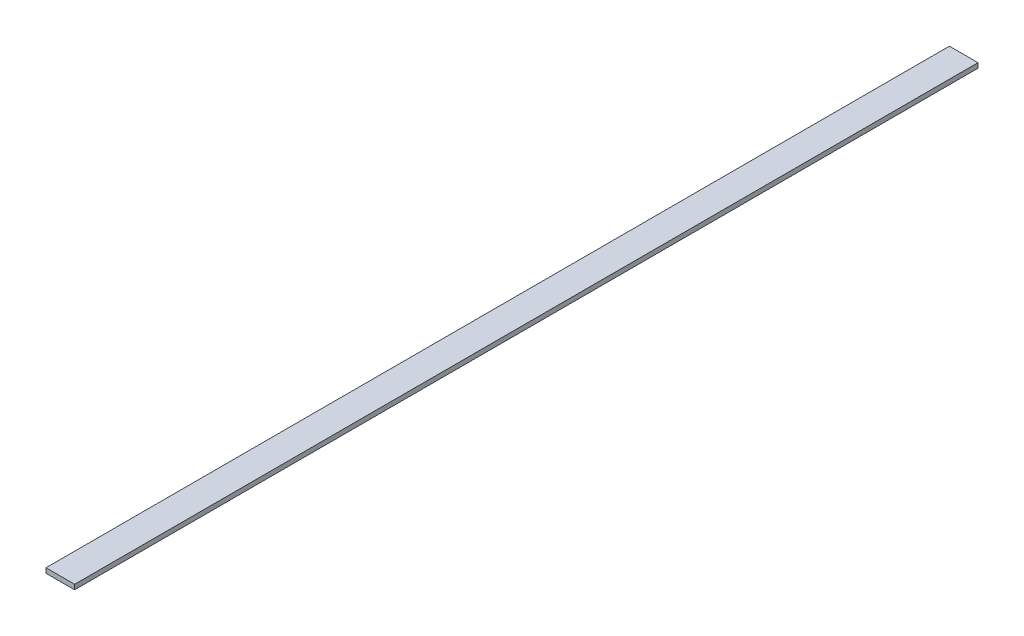
ISO-10303-21;
HEADER;
FILE_DESCRIPTION(('STEP AP214'),'2;1');
FILE_NAME('part.step','',(''),(''),'','','');
FILE_SCHEMA(('AUTOMOTIVE_DESIGN { 1 0 10303 214 1 1 1 1 }'));
ENDSEC;
DATA;
#1=APPLICATION_CONTEXT('core data for automotive mechanical design processes');
#2=APPLICATION_PROTOCOL_DEFINITION('international standard','automotive_design',2000,#1);
#3=PRODUCT_CONTEXT('',#1,'mechanical');
#4=PRODUCT('Part','Part','',(#3));
#5=PRODUCT_RELATED_PRODUCT_CATEGORY('part','',(#4));
#6=PRODUCT_DEFINITION_FORMATION('','',#4);
#7=PRODUCT_DEFINITION_CONTEXT('part definition',#1,'design');
#8=PRODUCT_DEFINITION('design','',#6,#7);
#9=PRODUCT_DEFINITION_SHAPE('','',#8);
#10=(LENGTH_UNIT() NAMED_UNIT(*) SI_UNIT(.MILLI.,.METRE.));
#11=(NAMED_UNIT(*) PLANE_ANGLE_UNIT() SI_UNIT($,.RADIAN.));
#12=(NAMED_UNIT(*) SI_UNIT($,.STERADIAN.) SOLID_ANGLE_UNIT());
#13=UNCERTAINTY_MEASURE_WITH_UNIT(LENGTH_MEASURE(1.E-05),#10,'distance_accuracy_value','');
#14=(GEOMETRIC_REPRESENTATION_CONTEXT(3) GLOBAL_UNCERTAINTY_ASSIGNED_CONTEXT((#13)) GLOBAL_UNIT_ASSIGNED_CONTEXT((#10,
#11,#12)) REPRESENTATION_CONTEXT('',''));
#15=CARTESIAN_POINT('',(0.,0.,0.));
#16=DIRECTION('',(0.,0.,1.));
#17=DIRECTION('',(1.,0.,0.));
#18=AXIS2_PLACEMENT_3D('',#15,#16,#17);
#19=CARTESIAN_POINT('',(0.,0.,600.));
#20=DIRECTION('',(1.,0.,0.));
#21=DIRECTION('',(0.,0.,-1.));
#22=AXIS2_PLACEMENT_3D('',#19,#20,#21);
#23=PLANE('',#22);
#24=DIRECTION('',(0.,-1.,0.));
#25=VECTOR('',#24,1.);
#26=CARTESIAN_POINT('',(0.,0.,0.));
#27=LINE('',#26,#25);
#28=CARTESIAN_POINT('',(0.,3.2,0.));
#29=VERTEX_POINT('',#28);
#30=CARTESIAN_POINT('',(0.,0.,0.));
#31=VERTEX_POINT('',#30);
#32=EDGE_CURVE('E107',#29,#31,#27,.T.);
#33=ORIENTED_EDGE('',*,*,#32,.T.);
#34=DIRECTION('',(0.,0.,-1.));
#35=VECTOR('',#34,1.);
#36=CARTESIAN_POINT('',(0.,0.,600.));
#37=LINE('',#36,#35);
#38=CARTESIAN_POINT('',(0.,0.,600.));
#39=VERTEX_POINT('',#38);
#40=EDGE_CURVE('E11',#39,#31,#37,.T.);
#41=ORIENTED_EDGE('',*,*,#40,.F.);
#42=DIRECTION('',(0.,-1.,0.));
#43=VECTOR('',#42,1.);
#44=CARTESIAN_POINT('',(0.,0.,600.));
#45=LINE('',#44,#43);
#46=CARTESIAN_POINT('',(0.,3.2,600.));
#47=VERTEX_POINT('',#46);
#48=EDGE_CURVE('E91',#47,#39,#45,.T.);
#49=ORIENTED_EDGE('',*,*,#48,.F.);
#50=DIRECTION('',(0.,0.,-1.));
#51=VECTOR('',#50,1.);
#52=CARTESIAN_POINT('',(0.,3.2,600.));
#53=LINE('',#52,#51);
#54=EDGE_CURVE('E103',#47,#29,#53,.T.);
#55=ORIENTED_EDGE('',*,*,#54,.T.);
#56=EDGE_LOOP('',(#33,#41,#49,#55));
#57=FACE_BOUND('',#56,.T.);
#58=ADVANCED_FACE('F39',(#57),#23,.F.);
#59=CARTESIAN_POINT('',(0.,0.,600.));
#60=DIRECTION('',(0.,1.,0.));
#61=DIRECTION('',(0.,0.,1.));
#62=AXIS2_PLACEMENT_3D('',#59,#60,#61);
#63=PLANE('',#62);
#64=DIRECTION('',(1.,0.,0.));
#65=VECTOR('',#64,1.);
#66=CARTESIAN_POINT('',(0.,0.,0.));
#67=LINE('',#66,#65);
#68=CARTESIAN_POINT('',(19.,0.,0.));
#69=VERTEX_POINT('',#68);
#70=EDGE_CURVE('E96',#31,#69,#67,.T.);
#71=ORIENTED_EDGE('',*,*,#70,.T.);
#72=DIRECTION('',(0.,0.,-1.));
#73=VECTOR('',#72,1.);
#74=CARTESIAN_POINT('',(19.,0.,600.));
#75=LINE('',#74,#73);
#76=CARTESIAN_POINT('',(19.,0.,600.));
#77=VERTEX_POINT('',#76);
#78=EDGE_CURVE('E48',#77,#69,#75,.T.);
#79=ORIENTED_EDGE('',*,*,#78,.F.);
#80=DIRECTION('',(1.,0.,0.));
#81=VECTOR('',#80,1.);
#82=CARTESIAN_POINT('',(0.,0.,600.));
#83=LINE('',#82,#81);
#84=EDGE_CURVE('E86',#39,#77,#83,.T.);
#85=ORIENTED_EDGE('',*,*,#84,.F.);
#86=ORIENTED_EDGE('',*,*,#40,.T.);
#87=EDGE_LOOP('',(#71,#79,#85,#86));
#88=FACE_BOUND('',#87,.T.);
#89=ADVANCED_FACE('F95',(#88),#63,.F.);
#90=CARTESIAN_POINT('',(19.,0.,600.));
#91=DIRECTION('',(-1.,0.,0.));
#92=DIRECTION('',(0.,0.,1.));
#93=AXIS2_PLACEMENT_3D('',#90,#91,#92);
#94=PLANE('',#93);
#95=DIRECTION('',(0.,1.,0.));
#96=VECTOR('',#95,1.);
#97=CARTESIAN_POINT('',(19.,0.,0.));
#98=LINE('',#97,#96);
#99=CARTESIAN_POINT('',(19.,3.2,0.));
#100=VERTEX_POINT('',#99);
#101=EDGE_CURVE('E73',#69,#100,#98,.T.);
#102=ORIENTED_EDGE('',*,*,#101,.T.);
#103=DIRECTION('',(0.,0.,-1.));
#104=VECTOR('',#103,1.);
#105=CARTESIAN_POINT('',(19.,3.2,600.));
#106=LINE('',#105,#104);
#107=CARTESIAN_POINT('',(19.,3.2,600.));
#108=VERTEX_POINT('',#107);
#109=EDGE_CURVE('E98',#108,#100,#106,.T.);
#110=ORIENTED_EDGE('',*,*,#109,.F.);
#111=DIRECTION('',(0.,1.,0.));
#112=VECTOR('',#111,1.);
#113=CARTESIAN_POINT('',(19.,0.,600.));
#114=LINE('',#113,#112);
#115=EDGE_CURVE('E89',#77,#108,#114,.T.);
#116=ORIENTED_EDGE('',*,*,#115,.F.);
#117=ORIENTED_EDGE('',*,*,#78,.T.);
#118=EDGE_LOOP('',(#102,#110,#116,#117));
#119=FACE_BOUND('',#118,.T.);
#120=ADVANCED_FACE('F99',(#119),#94,.F.);
#121=CARTESIAN_POINT('',(0.,3.2,600.));
#122=DIRECTION('',(0.,-1.,0.));
#123=DIRECTION('',(0.,0.,-1.));
#124=AXIS2_PLACEMENT_3D('',#121,#122,#123);
#125=PLANE('',#124);
#126=DIRECTION('',(-1.,0.,0.));
#127=VECTOR('',#126,1.);
#128=CARTESIAN_POINT('',(0.,3.2,0.));
#129=LINE('',#128,#127);
#130=EDGE_CURVE('E79',#100,#29,#129,.T.);
#131=ORIENTED_EDGE('',*,*,#130,.T.);
#132=ORIENTED_EDGE('',*,*,#54,.F.);
#133=DIRECTION('',(-1.,0.,0.));
#134=VECTOR('',#133,1.);
#135=CARTESIAN_POINT('',(0.,3.2,600.));
#136=LINE('',#135,#134);
#137=EDGE_CURVE('E56',#108,#47,#136,.T.);
#138=ORIENTED_EDGE('',*,*,#137,.F.);
#139=ORIENTED_EDGE('',*,*,#109,.T.);
#140=EDGE_LOOP('',(#131,#132,#138,#139));
#141=FACE_BOUND('',#140,.T.);
#142=ADVANCED_FACE('F120',(#141),#125,.F.);
#143=CARTESIAN_POINT('',(0.,0.,600.));
#144=DIRECTION('',(0.,0.,-1.));
#145=DIRECTION('',(-1.,0.,0.));
#146=AXIS2_PLACEMENT_3D('',#143,#144,#145);
#147=PLANE('',#146);
#148=ORIENTED_EDGE('',*,*,#48,.T.);
#149=ORIENTED_EDGE('',*,*,#84,.T.);
#150=ORIENTED_EDGE('',*,*,#115,.T.);
#151=ORIENTED_EDGE('',*,*,#137,.T.);
#152=EDGE_LOOP('',(#148,#149,#150,#151));
#153=FACE_BOUND('',#152,.T.);
#154=ADVANCED_FACE('F87',(#153),#147,.F.);
#155=CARTESIAN_POINT('',(0.,0.,0.));
#156=DIRECTION('',(0.,0.,-1.));
#157=DIRECTION('',(-1.,0.,0.));
#158=AXIS2_PLACEMENT_3D('',#155,#156,#157);
#159=PLANE('',#158);
#160=ORIENTED_EDGE('',*,*,#32,.F.);
#161=ORIENTED_EDGE('',*,*,#130,.F.);
#162=ORIENTED_EDGE('',*,*,#101,.F.);
#163=ORIENTED_EDGE('',*,*,#70,.F.);
#164=EDGE_LOOP('',(#160,#161,#162,#163));
#165=FACE_BOUND('',#164,.T.);
#166=ADVANCED_FACE('F123',(#165),#159,.T.);
#167=CLOSED_SHELL('',(#58,#89,#120,#142,#154,#166));
#168=MANIFOLD_SOLID_BREP('B2',#167);
#169=ADVANCED_BREP_SHAPE_REPRESENTATION('',(#18,#168),#14);
#170=SHAPE_DEFINITION_REPRESENTATION(#9,#169);
ENDSEC;
END-ISO-10303-21;
